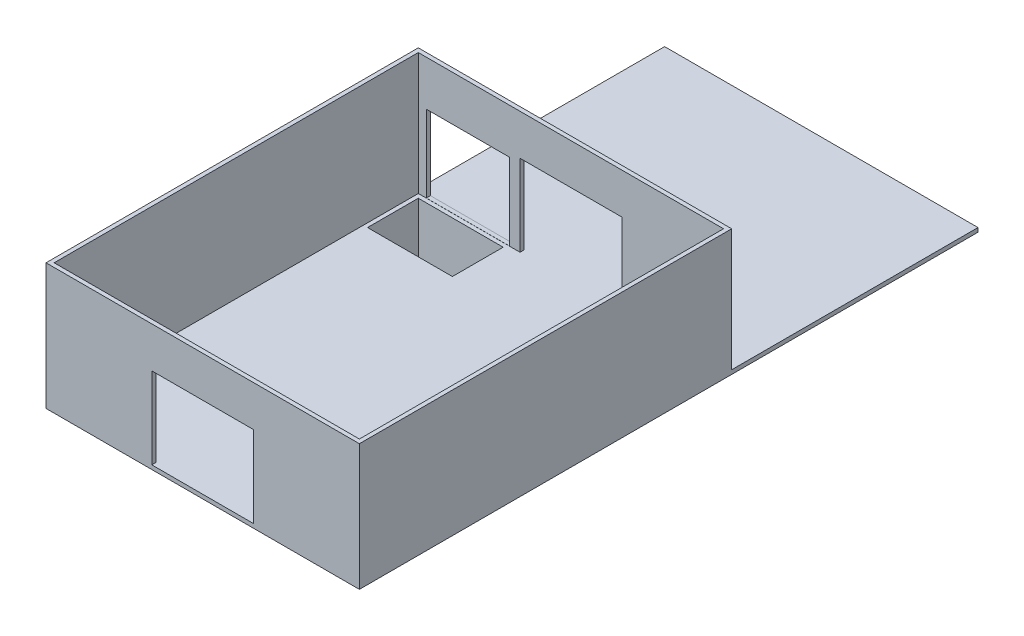
ISO-10303-21;
HEADER;
FILE_DESCRIPTION(('STEP AP214'),'2;1');
FILE_NAME('part.step','',(''),(''),'','','');
FILE_SCHEMA(('AUTOMOTIVE_DESIGN { 1 0 10303 214 1 1 1 1 }'));
ENDSEC;
DATA;
#1=APPLICATION_CONTEXT('core data for automotive mechanical design processes');
#2=APPLICATION_PROTOCOL_DEFINITION('international standard','automotive_design',2000,#1);
#3=PRODUCT_CONTEXT('',#1,'mechanical');
#4=PRODUCT('Part','Part','',(#3));
#5=PRODUCT_RELATED_PRODUCT_CATEGORY('part','',(#4));
#6=PRODUCT_DEFINITION_FORMATION('','',#4);
#7=PRODUCT_DEFINITION_CONTEXT('part definition',#1,'design');
#8=PRODUCT_DEFINITION('design','',#6,#7);
#9=PRODUCT_DEFINITION_SHAPE('','',#8);
#10=(LENGTH_UNIT() NAMED_UNIT(*) SI_UNIT(.MILLI.,.METRE.));
#11=(NAMED_UNIT(*) PLANE_ANGLE_UNIT() SI_UNIT($,.RADIAN.));
#12=(NAMED_UNIT(*) SI_UNIT($,.STERADIAN.) SOLID_ANGLE_UNIT());
#13=UNCERTAINTY_MEASURE_WITH_UNIT(LENGTH_MEASURE(1.E-05),#10,'distance_accuracy_value','');
#14=(GEOMETRIC_REPRESENTATION_CONTEXT(3) GLOBAL_UNCERTAINTY_ASSIGNED_CONTEXT((#13)) GLOBAL_UNIT_ASSIGNED_CONTEXT((#10,
#11,#12)) REPRESENTATION_CONTEXT('',''));
#15=CARTESIAN_POINT('',(0.,0.,0.));
#16=DIRECTION('',(0.,0.,1.));
#17=DIRECTION('',(1.,0.,0.));
#18=AXIS2_PLACEMENT_3D('',#15,#16,#17);
#19=CARTESIAN_POINT('',(-7700.,6000.,0.));
#20=DIRECTION('',(1.,0.,0.));
#21=DIRECTION('',(0.,0.,-1.));
#22=AXIS2_PLACEMENT_3D('',#19,#20,#21);
#23=PLANE('',#22);
#24=DIRECTION('',(0.,1.,0.));
#25=VECTOR('',#24,1.);
#26=CARTESIAN_POINT('',(-7700.,6000.,-3095.4255966185));
#27=LINE('',#26,#25);
#28=CARTESIAN_POINT('',(-7700.,0.,-3095.4255966185));
#29=VERTEX_POINT('',#28);
#30=CARTESIAN_POINT('',(-7700.,6000.,-3095.4255966185));
#31=VERTEX_POINT('',#30);
#32=EDGE_CURVE('E262',#29,#31,#27,.T.);
#33=ORIENTED_EDGE('',*,*,#32,.F.);
#34=DIRECTION('',(0.,0.,-1.));
#35=VECTOR('',#34,1.);
#36=CARTESIAN_POINT('',(-7700.,0.,0.));
#37=LINE('',#36,#35);
#38=CARTESIAN_POINT('',(-7700.,0.,-15200.));
#39=VERTEX_POINT('',#38);
#40=EDGE_CURVE('E272',#29,#39,#37,.T.);
#41=ORIENTED_EDGE('',*,*,#40,.T.);
#42=DIRECTION('',(0.,-1.,0.));
#43=VECTOR('',#42,1.);
#44=CARTESIAN_POINT('',(-7700.,6000.,-15200.));
#45=LINE('',#44,#43);
#46=CARTESIAN_POINT('',(-7700.,-200.,-15200.));
#47=VERTEX_POINT('',#46);
#48=EDGE_CURVE('E68',#39,#47,#45,.T.);
#49=ORIENTED_EDGE('',*,*,#48,.T.);
#50=DIRECTION('',(0.,0.,1.));
#51=VECTOR('',#50,1.);
#52=CARTESIAN_POINT('',(-7700.,-200.,0.));
#53=LINE('',#52,#51);
#54=CARTESIAN_POINT('',(-7700.,-200.,15200.));
#55=VERTEX_POINT('',#54);
#56=EDGE_CURVE('E426',#47,#55,#53,.T.);
#57=ORIENTED_EDGE('',*,*,#56,.T.);
#58=DIRECTION('',(0.,-1.,0.));
#59=VECTOR('',#58,1.);
#60=CARTESIAN_POINT('',(-7700.,6000.,15200.));
#61=LINE('',#60,#59);
#62=CARTESIAN_POINT('',(-7700.,6000.,15200.));
#63=VERTEX_POINT('',#62);
#64=EDGE_CURVE('E471',#63,#55,#61,.T.);
#65=ORIENTED_EDGE('',*,*,#64,.F.);
#66=DIRECTION('',(0.,0.,1.));
#67=VECTOR('',#66,1.);
#68=CARTESIAN_POINT('',(-7700.,6000.,0.));
#69=LINE('',#68,#67);
#70=EDGE_CURVE('E282',#31,#63,#69,.T.);
#71=ORIENTED_EDGE('',*,*,#70,.F.);
#72=EDGE_LOOP('',(#33,#41,#49,#57,#65,#71));
#73=FACE_BOUND('',#72,.T.);
#74=ADVANCED_FACE('F60',(#73),#23,.F.);
#75=CARTESIAN_POINT('',(7700.,6000.,-2.24966244463519E-13));
#76=DIRECTION('',(1.,0.,0.));
#77=DIRECTION('',(0.,0.,-1.));
#78=AXIS2_PLACEMENT_3D('',#75,#76,#77);
#79=PLANE('',#78);
#80=DIRECTION('',(0.,0.,-1.));
#81=VECTOR('',#80,1.);
#82=CARTESIAN_POINT('',(7700.,0.,-2.24966244463519E-13));
#83=LINE('',#82,#81);
#84=CARTESIAN_POINT('',(7700.,0.,-3095.4255966185));
#85=VERTEX_POINT('',#84);
#86=CARTESIAN_POINT('',(7700.,0.,-15200.));
#87=VERTEX_POINT('',#86);
#88=EDGE_CURVE('E279',#85,#87,#83,.T.);
#89=ORIENTED_EDGE('',*,*,#88,.F.);
#90=DIRECTION('',(0.,1.,0.));
#91=VECTOR('',#90,1.);
#92=CARTESIAN_POINT('',(7700.,6000.,-3095.4255966185));
#93=LINE('',#92,#91);
#94=CARTESIAN_POINT('',(7700.,6000.,-3095.4255966185));
#95=VERTEX_POINT('',#94);
#96=EDGE_CURVE('E283',#85,#95,#93,.T.);
#97=ORIENTED_EDGE('',*,*,#96,.T.);
#98=DIRECTION('',(0.,0.,1.));
#99=VECTOR('',#98,1.);
#100=CARTESIAN_POINT('',(7700.,6000.,-2.24966244463519E-13));
#101=LINE('',#100,#99);
#102=CARTESIAN_POINT('',(7700.,6000.,15200.));
#103=VERTEX_POINT('',#102);
#104=EDGE_CURVE('E452',#95,#103,#101,.T.);
#105=ORIENTED_EDGE('',*,*,#104,.T.);
#106=DIRECTION('',(0.,-1.,0.));
#107=VECTOR('',#106,1.);
#108=CARTESIAN_POINT('',(7700.,6000.,15200.));
#109=LINE('',#108,#107);
#110=CARTESIAN_POINT('',(7700.,-200.,15200.));
#111=VERTEX_POINT('',#110);
#112=EDGE_CURVE('E468',#103,#111,#109,.T.);
#113=ORIENTED_EDGE('',*,*,#112,.T.);
#114=DIRECTION('',(0.,0.,1.));
#115=VECTOR('',#114,1.);
#116=CARTESIAN_POINT('',(7700.,-200.,-2.24966244463519E-13));
#117=LINE('',#116,#115);
#118=CARTESIAN_POINT('',(7700.,-200.,-15200.));
#119=VERTEX_POINT('',#118);
#120=EDGE_CURVE('E432',#119,#111,#117,.T.);
#121=ORIENTED_EDGE('',*,*,#120,.F.);
#122=DIRECTION('',(0.,-1.,0.));
#123=VECTOR('',#122,1.);
#124=CARTESIAN_POINT('',(7700.,6000.,-15200.));
#125=LINE('',#124,#123);
#126=EDGE_CURVE('E466',#87,#119,#125,.T.);
#127=ORIENTED_EDGE('',*,*,#126,.F.);
#128=EDGE_LOOP('',(#89,#97,#105,#113,#121,#127));
#129=FACE_BOUND('',#128,.T.);
#130=ADVANCED_FACE('F522',(#129),#79,.T.);
#131=CARTESIAN_POINT('',(0.,6000.,0.));
#132=DIRECTION('',(0.,1.,0.));
#133=DIRECTION('',(0.,0.,1.));
#134=AXIS2_PLACEMENT_3D('',#131,#132,#133);
#135=PLANE('',#134);
#136=DIRECTION('',(1.,0.,0.));
#137=VECTOR('',#136,1.);
#138=CARTESIAN_POINT('',(0.,6000.,-2895.4255966185));
#139=LINE('',#138,#137);
#140=CARTESIAN_POINT('',(-7500.,6000.,-2895.4255966185));
#141=VERTEX_POINT('',#140);
#142=CARTESIAN_POINT('',(7500.,6000.,-2895.4255966185));
#143=VERTEX_POINT('',#142);
#144=EDGE_CURVE('E268',#141,#143,#139,.T.);
#145=ORIENTED_EDGE('',*,*,#144,.T.);
#146=DIRECTION('',(0.,0.,1.));
#147=VECTOR('',#146,1.);
#148=CARTESIAN_POINT('',(7500.,6000.,0.));
#149=LINE('',#148,#147);
#150=CARTESIAN_POINT('',(7500.,6000.,15000.));
#151=VERTEX_POINT('',#150);
#152=EDGE_CURVE('E438',#143,#151,#149,.T.);
#153=ORIENTED_EDGE('',*,*,#152,.T.);
#154=DIRECTION('',(1.,0.,0.));
#155=VECTOR('',#154,1.);
#156=CARTESIAN_POINT('',(0.,6000.,15000.));
#157=LINE('',#156,#155);
#158=CARTESIAN_POINT('',(-7500.,6000.,15000.));
#159=VERTEX_POINT('',#158);
#160=EDGE_CURVE('E440',#159,#151,#157,.T.);
#161=ORIENTED_EDGE('',*,*,#160,.F.);
#162=DIRECTION('',(0.,0.,1.));
#163=VECTOR('',#162,1.);
#164=CARTESIAN_POINT('',(-7500.,6000.,1.11022302462516E-12));
#165=LINE('',#164,#163);
#166=EDGE_CURVE('E443',#141,#159,#165,.T.);
#167=ORIENTED_EDGE('',*,*,#166,.F.);
#168=EDGE_LOOP('',(#145,#153,#161,#167));
#169=FACE_BOUND('',#168,.T.);
#170=ORIENTED_EDGE('',*,*,#104,.F.);
#171=DIRECTION('',(1.,0.,0.));
#172=VECTOR('',#171,1.);
#173=CARTESIAN_POINT('',(0.,6000.,-3095.4255966185));
#174=LINE('',#173,#172);
#175=EDGE_CURVE('E446',#31,#95,#174,.T.);
#176=ORIENTED_EDGE('',*,*,#175,.F.);
#177=ORIENTED_EDGE('',*,*,#70,.T.);
#178=DIRECTION('',(1.,0.,0.));
#179=VECTOR('',#178,1.);
#180=CARTESIAN_POINT('',(0.,6000.,15200.));
#181=LINE('',#180,#179);
#182=EDGE_CURVE('E449',#63,#103,#181,.T.);
#183=ORIENTED_EDGE('',*,*,#182,.T.);
#184=EDGE_LOOP('',(#170,#176,#177,#183));
#185=FACE_BOUND('',#184,.T.);
#186=ADVANCED_FACE('F499',(#169,#185),#135,.T.);
#187=CARTESIAN_POINT('',(0.,6000.,-15200.));
#188=DIRECTION('',(0.,0.,-1.));
#189=DIRECTION('',(-1.,0.,0.));
#190=AXIS2_PLACEMENT_3D('',#187,#188,#189);
#191=PLANE('',#190);
#192=DIRECTION('',(1.,0.,0.));
#193=VECTOR('',#192,1.);
#194=CARTESIAN_POINT('',(-2500.,0.,-15200.));
#195=LINE('',#194,#193);
#196=EDGE_CURVE('E276',#39,#87,#195,.T.);
#197=ORIENTED_EDGE('',*,*,#196,.T.);
#198=ORIENTED_EDGE('',*,*,#126,.T.);
#199=DIRECTION('',(1.,0.,0.));
#200=VECTOR('',#199,1.);
#201=CARTESIAN_POINT('',(0.,-200.,-15200.));
#202=LINE('',#201,#200);
#203=EDGE_CURVE('E423',#47,#119,#202,.T.);
#204=ORIENTED_EDGE('',*,*,#203,.F.);
#205=ORIENTED_EDGE('',*,*,#48,.F.);
#206=EDGE_LOOP('',(#197,#198,#204,#205));
#207=FACE_BOUND('',#206,.T.);
#208=ADVANCED_FACE('F526',(#207),#191,.T.);
#209=CARTESIAN_POINT('',(0.,6000.,15200.));
#210=DIRECTION('',(0.,0.,-1.));
#211=DIRECTION('',(-1.,0.,0.));
#212=AXIS2_PLACEMENT_3D('',#209,#210,#211);
#213=PLANE('',#212);
#214=DIRECTION('',(1.,0.,0.));
#215=VECTOR('',#214,1.);
#216=CARTESIAN_POINT('',(-2500.,0.,15200.));
#217=LINE('',#216,#215);
#218=CARTESIAN_POINT('',(-2500.,0.,15200.));
#219=VERTEX_POINT('',#218);
#220=CARTESIAN_POINT('',(2500.,0.,15200.));
#221=VERTEX_POINT('',#220);
#222=EDGE_CURVE('E383',#219,#221,#217,.T.);
#223=ORIENTED_EDGE('',*,*,#222,.F.);
#224=DIRECTION('',(0.,-1.,0.));
#225=VECTOR('',#224,1.);
#226=CARTESIAN_POINT('',(-2500.,0.,15200.));
#227=LINE('',#226,#225);
#228=CARTESIAN_POINT('',(-2500.,4000.,15200.));
#229=VERTEX_POINT('',#228);
#230=EDGE_CURVE('E378',#229,#219,#227,.T.);
#231=ORIENTED_EDGE('',*,*,#230,.F.);
#232=DIRECTION('',(-1.,0.,0.));
#233=VECTOR('',#232,1.);
#234=CARTESIAN_POINT('',(-2500.,4000.,15200.));
#235=LINE('',#234,#233);
#236=CARTESIAN_POINT('',(2500.,4000.,15200.));
#237=VERTEX_POINT('',#236);
#238=EDGE_CURVE('E381',#237,#229,#235,.T.);
#239=ORIENTED_EDGE('',*,*,#238,.F.);
#240=DIRECTION('',(0.,1.,0.));
#241=VECTOR('',#240,1.);
#242=CARTESIAN_POINT('',(2500.,0.,15200.));
#243=LINE('',#242,#241);
#244=EDGE_CURVE('E386',#221,#237,#243,.T.);
#245=ORIENTED_EDGE('',*,*,#244,.F.);
#246=EDGE_LOOP('',(#223,#231,#239,#245));
#247=FACE_BOUND('',#246,.T.);
#248=ORIENTED_EDGE('',*,*,#64,.T.);
#249=DIRECTION('',(1.,0.,0.));
#250=VECTOR('',#249,1.);
#251=CARTESIAN_POINT('',(0.,-200.,15200.));
#252=LINE('',#251,#250);
#253=EDGE_CURVE('E429',#55,#111,#252,.T.);
#254=ORIENTED_EDGE('',*,*,#253,.T.);
#255=ORIENTED_EDGE('',*,*,#112,.F.);
#256=ORIENTED_EDGE('',*,*,#182,.F.);
#257=EDGE_LOOP('',(#248,#254,#255,#256));
#258=FACE_BOUND('',#257,.T.);
#259=ADVANCED_FACE('F533',(#247,#258),#213,.F.);
#260=CARTESIAN_POINT('',(0.,6000.,-3095.4255966185));
#261=DIRECTION('',(0.,0.,-1.));
#262=DIRECTION('',(-1.,0.,0.));
#263=AXIS2_PLACEMENT_3D('',#260,#261,#262);
#264=PLANE('',#263);
#265=DIRECTION('',(0.,-1.,0.));
#266=VECTOR('',#265,1.);
#267=CARTESIAN_POINT('',(-3013.08847845024,6000.,-3095.4255966185));
#268=LINE('',#267,#266);
#269=CARTESIAN_POINT('',(-3013.08847845024,3786.82054214032,-3095.4255966185));
#270=VERTEX_POINT('',#269);
#271=CARTESIAN_POINT('',(-3013.08847845024,5.91228646919756,-3095.4255966185));
#272=VERTEX_POINT('',#271);
#273=EDGE_CURVE('E311',#270,#272,#268,.T.);
#274=ORIENTED_EDGE('',*,*,#273,.F.);
#275=DIRECTION('',(1.,0.,0.));
#276=VECTOR('',#275,1.);
#277=CARTESIAN_POINT('',(2.40009307716138E-13,3786.82054214032,-3095.4255966185));
#278=LINE('',#277,#276);
#279=CARTESIAN_POINT('',(-7108.13431667134,3786.82054214032,-3095.4255966185));
#280=VERTEX_POINT('',#279);
#281=EDGE_CURVE('E301',#280,#270,#278,.T.);
#282=ORIENTED_EDGE('',*,*,#281,.F.);
#283=DIRECTION('',(0.,1.,0.));
#284=VECTOR('',#283,1.);
#285=CARTESIAN_POINT('',(-7108.13431667134,6000.,-3095.4255966185));
#286=LINE('',#285,#284);
#287=CARTESIAN_POINT('',(-7108.13431667134,5.91228646919706,-3095.4255966185));
#288=VERTEX_POINT('',#287);
#289=EDGE_CURVE('E307',#288,#280,#286,.T.);
#290=ORIENTED_EDGE('',*,*,#289,.F.);
#291=DIRECTION('',(-1.,0.,0.));
#292=VECTOR('',#291,1.);
#293=CARTESIAN_POINT('',(7.31285681367118E-13,5.91228646919717,-3095.4255966185));
#294=LINE('',#293,#292);
#295=EDGE_CURVE('E309',#272,#288,#294,.T.);
#296=ORIENTED_EDGE('',*,*,#295,.F.);
#297=EDGE_LOOP('',(#274,#282,#290,#296));
#298=FACE_BOUND('',#297,.T.);
#299=DIRECTION('',(0.,1.,0.));
#300=VECTOR('',#299,1.);
#301=CARTESIAN_POINT('',(-2500.,6000.,-3095.4255966185));
#302=LINE('',#301,#300);
#303=CARTESIAN_POINT('',(-2500.,0.,-3095.4255966185));
#304=VERTEX_POINT('',#303);
#305=CARTESIAN_POINT('',(-2500.,4000.,-3095.4255966185));
#306=VERTEX_POINT('',#305);
#307=EDGE_CURVE('E265',#304,#306,#302,.T.);
#308=ORIENTED_EDGE('',*,*,#307,.F.);
#309=DIRECTION('',(1.,0.,0.));
#310=VECTOR('',#309,1.);
#311=CARTESIAN_POINT('',(0.,0.,-3095.4255966185));
#312=LINE('',#311,#310);
#313=EDGE_CURVE('E258',#29,#304,#312,.T.);
#314=ORIENTED_EDGE('',*,*,#313,.F.);
#315=ORIENTED_EDGE('',*,*,#32,.T.);
#316=ORIENTED_EDGE('',*,*,#175,.T.);
#317=ORIENTED_EDGE('',*,*,#96,.F.);
#318=CARTESIAN_POINT('',(2500.,0.,-3095.4255966185));
#319=VERTEX_POINT('',#318);
#320=EDGE_CURVE('E269',#319,#85,#312,.T.);
#321=ORIENTED_EDGE('',*,*,#320,.F.);
#322=DIRECTION('',(0.,-1.,0.));
#323=VECTOR('',#322,1.);
#324=CARTESIAN_POINT('',(2500.,6000.,-3095.4255966185));
#325=LINE('',#324,#323);
#326=CARTESIAN_POINT('',(2500.,4000.,-3095.4255966185));
#327=VERTEX_POINT('',#326);
#328=EDGE_CURVE('E409',#327,#319,#325,.T.);
#329=ORIENTED_EDGE('',*,*,#328,.F.);
#330=DIRECTION('',(1.,0.,0.));
#331=VECTOR('',#330,1.);
#332=CARTESIAN_POINT('',(0.,4000.,-3095.4255966185));
#333=LINE('',#332,#331);
#334=EDGE_CURVE('E421',#306,#327,#333,.T.);
#335=ORIENTED_EDGE('',*,*,#334,.F.);
#336=EDGE_LOOP('',(#308,#314,#315,#316,#317,#321,#329,#335));
#337=FACE_BOUND('',#336,.T.);
#338=ADVANCED_FACE('F260',(#298,#337),#264,.T.);
#339=CARTESIAN_POINT('',(0.,6000.,-2895.4255966185));
#340=DIRECTION('',(0.,0.,-1.));
#341=DIRECTION('',(-1.,0.,0.));
#342=AXIS2_PLACEMENT_3D('',#339,#340,#341);
#343=PLANE('',#342);
#344=DIRECTION('',(-1.,0.,0.));
#345=VECTOR('',#344,1.);
#346=CARTESIAN_POINT('',(-3013.08847845024,3786.82054214032,-2895.4255966185));
#347=LINE('',#346,#345);
#348=CARTESIAN_POINT('',(-3013.08847845024,3786.82054214032,-2895.4255966185));
#349=VERTEX_POINT('',#348);
#350=CARTESIAN_POINT('',(-7108.13431667134,3786.82054214032,-2895.4255966185));
#351=VERTEX_POINT('',#350);
#352=EDGE_CURVE('E290',#349,#351,#347,.T.);
#353=ORIENTED_EDGE('',*,*,#352,.F.);
#354=DIRECTION('',(0.,1.,0.));
#355=VECTOR('',#354,1.);
#356=CARTESIAN_POINT('',(-3013.08847845024,5.91228646919756,-2895.4255966185));
#357=LINE('',#356,#355);
#358=CARTESIAN_POINT('',(-3013.08847845024,5.91228646919756,-2895.4255966185));
#359=VERTEX_POINT('',#358);
#360=EDGE_CURVE('E83',#359,#349,#357,.T.);
#361=ORIENTED_EDGE('',*,*,#360,.F.);
#362=DIRECTION('',(1.,0.,0.));
#363=VECTOR('',#362,1.);
#364=CARTESIAN_POINT('',(-3013.08847845024,5.91228646919756,-2895.4255966185));
#365=LINE('',#364,#363);
#366=CARTESIAN_POINT('',(-7108.13431667134,5.91228646919706,-2895.4255966185));
#367=VERTEX_POINT('',#366);
#368=EDGE_CURVE('E295',#367,#359,#365,.T.);
#369=ORIENTED_EDGE('',*,*,#368,.F.);
#370=DIRECTION('',(0.,-1.,0.));
#371=VECTOR('',#370,1.);
#372=CARTESIAN_POINT('',(-7108.13431667134,5.91228646919706,-2895.4255966185));
#373=LINE('',#372,#371);
#374=EDGE_CURVE('E292',#351,#367,#373,.T.);
#375=ORIENTED_EDGE('',*,*,#374,.F.);
#376=EDGE_LOOP('',(#353,#361,#369,#375));
#377=FACE_BOUND('',#376,.T.);
#378=DIRECTION('',(0.,-1.,0.));
#379=VECTOR('',#378,1.);
#380=CARTESIAN_POINT('',(-7500.,6000.,-2895.4255966185));
#381=LINE('',#380,#379);
#382=CARTESIAN_POINT('',(-7500.,0.,-2895.4255966185));
#383=VERTEX_POINT('',#382);
#384=EDGE_CURVE('E454',#141,#383,#381,.T.);
#385=ORIENTED_EDGE('',*,*,#384,.T.);
#386=DIRECTION('',(1.,0.,0.));
#387=VECTOR('',#386,1.);
#388=CARTESIAN_POINT('',(0.,0.,-2895.4255966185));
#389=LINE('',#388,#387);
#390=CARTESIAN_POINT('',(-2500.,0.,-2895.4255966185));
#391=VERTEX_POINT('',#390);
#392=EDGE_CURVE('E455',#383,#391,#389,.T.);
#393=ORIENTED_EDGE('',*,*,#392,.T.);
#394=DIRECTION('',(0.,1.,0.));
#395=VECTOR('',#394,1.);
#396=CARTESIAN_POINT('',(-2500.,6000.,-2895.4255966185));
#397=LINE('',#396,#395);
#398=CARTESIAN_POINT('',(-2500.,4000.,-2895.4255966185));
#399=VERTEX_POINT('',#398);
#400=EDGE_CURVE('E414',#391,#399,#397,.T.);
#401=ORIENTED_EDGE('',*,*,#400,.T.);
#402=DIRECTION('',(1.,0.,0.));
#403=VECTOR('',#402,1.);
#404=CARTESIAN_POINT('',(0.,4000.,-2895.4255966185));
#405=LINE('',#404,#403);
#406=CARTESIAN_POINT('',(2500.,4000.,-2895.4255966185));
#407=VERTEX_POINT('',#406);
#408=EDGE_CURVE('E418',#399,#407,#405,.T.);
#409=ORIENTED_EDGE('',*,*,#408,.T.);
#410=DIRECTION('',(0.,-1.,0.));
#411=VECTOR('',#410,1.);
#412=CARTESIAN_POINT('',(2500.,6000.,-2895.4255966185));
#413=LINE('',#412,#411);
#414=CARTESIAN_POINT('',(2500.,0.,-2895.4255966185));
#415=VERTEX_POINT('',#414);
#416=EDGE_CURVE('E406',#407,#415,#413,.T.);
#417=ORIENTED_EDGE('',*,*,#416,.T.);
#418=CARTESIAN_POINT('',(7500.,0.,-2895.4255966185));
#419=VERTEX_POINT('',#418);
#420=EDGE_CURVE('E435',#415,#419,#389,.T.);
#421=ORIENTED_EDGE('',*,*,#420,.T.);
#422=DIRECTION('',(0.,-1.,0.));
#423=VECTOR('',#422,1.);
#424=CARTESIAN_POINT('',(7500.,6000.,-2895.4255966185));
#425=LINE('',#424,#423);
#426=EDGE_CURVE('E469',#143,#419,#425,.T.);
#427=ORIENTED_EDGE('',*,*,#426,.F.);
#428=ORIENTED_EDGE('',*,*,#144,.F.);
#429=EDGE_LOOP('',(#385,#393,#401,#409,#417,#421,#427,#428));
#430=FACE_BOUND('',#429,.T.);
#431=ADVANCED_FACE('F62',(#377,#430),#343,.F.);
#432=CARTESIAN_POINT('',(7500.,6000.,0.));
#433=DIRECTION('',(1.,0.,0.));
#434=DIRECTION('',(0.,0.,-1.));
#435=AXIS2_PLACEMENT_3D('',#432,#433,#434);
#436=PLANE('',#435);
#437=DIRECTION('',(0.,0.,1.));
#438=VECTOR('',#437,1.);
#439=CARTESIAN_POINT('',(7500.,0.,0.));
#440=LINE('',#439,#438);
#441=CARTESIAN_POINT('',(7500.,0.,15000.));
#442=VERTEX_POINT('',#441);
#443=EDGE_CURVE('E457',#419,#442,#440,.T.);
#444=ORIENTED_EDGE('',*,*,#443,.T.);
#445=DIRECTION('',(0.,-1.,0.));
#446=VECTOR('',#445,1.);
#447=CARTESIAN_POINT('',(7500.,6000.,15000.));
#448=LINE('',#447,#446);
#449=EDGE_CURVE('E479',#151,#442,#448,.T.);
#450=ORIENTED_EDGE('',*,*,#449,.F.);
#451=ORIENTED_EDGE('',*,*,#152,.F.);
#452=ORIENTED_EDGE('',*,*,#426,.T.);
#453=EDGE_LOOP('',(#444,#450,#451,#452));
#454=FACE_BOUND('',#453,.T.);
#455=ADVANCED_FACE('F484',(#454),#436,.F.);
#456=CARTESIAN_POINT('',(0.,6000.,15000.));
#457=DIRECTION('',(0.,0.,-1.));
#458=DIRECTION('',(-1.,0.,0.));
#459=AXIS2_PLACEMENT_3D('',#456,#457,#458);
#460=PLANE('',#459);
#461=DIRECTION('',(0.,1.,0.));
#462=VECTOR('',#461,1.);
#463=CARTESIAN_POINT('',(-2500.,6000.,15000.));
#464=LINE('',#463,#462);
#465=CARTESIAN_POINT('',(-2500.,0.,15000.));
#466=VERTEX_POINT('',#465);
#467=CARTESIAN_POINT('',(-2500.,4000.,15000.));
#468=VERTEX_POINT('',#467);
#469=EDGE_CURVE('E412',#466,#468,#464,.T.);
#470=ORIENTED_EDGE('',*,*,#469,.F.);
#471=DIRECTION('',(1.,0.,0.));
#472=VECTOR('',#471,1.);
#473=CARTESIAN_POINT('',(0.,0.,15000.));
#474=LINE('',#473,#472);
#475=CARTESIAN_POINT('',(-7500.,0.,15000.));
#476=VERTEX_POINT('',#475);
#477=EDGE_CURVE('E461',#476,#466,#474,.T.);
#478=ORIENTED_EDGE('',*,*,#477,.F.);
#479=DIRECTION('',(0.,-1.,0.));
#480=VECTOR('',#479,1.);
#481=CARTESIAN_POINT('',(-7500.,6000.,15000.));
#482=LINE('',#481,#480);
#483=EDGE_CURVE('E476',#159,#476,#482,.T.);
#484=ORIENTED_EDGE('',*,*,#483,.F.);
#485=ORIENTED_EDGE('',*,*,#160,.T.);
#486=ORIENTED_EDGE('',*,*,#449,.T.);
#487=CARTESIAN_POINT('',(2500.,0.,15000.));
#488=VERTEX_POINT('',#487);
#489=EDGE_CURVE('E460',#488,#442,#474,.T.);
#490=ORIENTED_EDGE('',*,*,#489,.F.);
#491=DIRECTION('',(0.,-1.,0.));
#492=VECTOR('',#491,1.);
#493=CARTESIAN_POINT('',(2500.,6000.,15000.));
#494=LINE('',#493,#492);
#495=CARTESIAN_POINT('',(2500.,4000.,15000.));
#496=VERTEX_POINT('',#495);
#497=EDGE_CURVE('E403',#496,#488,#494,.T.);
#498=ORIENTED_EDGE('',*,*,#497,.F.);
#499=DIRECTION('',(1.,0.,0.));
#500=VECTOR('',#499,1.);
#501=CARTESIAN_POINT('',(0.,4000.,15000.));
#502=LINE('',#501,#500);
#503=EDGE_CURVE('E12',#468,#496,#502,.T.);
#504=ORIENTED_EDGE('',*,*,#503,.F.);
#505=EDGE_LOOP('',(#470,#478,#484,#485,#486,#490,#498,#504));
#506=FACE_BOUND('',#505,.T.);
#507=ADVANCED_FACE('F495',(#506),#460,.T.);
#508=CARTESIAN_POINT('',(-7500.,6000.,1.11022302462516E-12));
#509=DIRECTION('',(1.,0.,0.));
#510=DIRECTION('',(0.,0.,-1.));
#511=AXIS2_PLACEMENT_3D('',#508,#509,#510);
#512=PLANE('',#511);
#513=DIRECTION('',(0.,0.,1.));
#514=VECTOR('',#513,1.);
#515=CARTESIAN_POINT('',(-7500.,0.,1.11022302462516E-12));
#516=LINE('',#515,#514);
#517=EDGE_CURVE('E464',#383,#476,#516,.T.);
#518=ORIENTED_EDGE('',*,*,#517,.F.);
#519=ORIENTED_EDGE('',*,*,#384,.F.);
#520=ORIENTED_EDGE('',*,*,#166,.T.);
#521=ORIENTED_EDGE('',*,*,#483,.T.);
#522=EDGE_LOOP('',(#518,#519,#520,#521));
#523=FACE_BOUND('',#522,.T.);
#524=ADVANCED_FACE('F502',(#523),#512,.T.);
#525=CARTESIAN_POINT('',(0.,0.,0.));
#526=DIRECTION('',(0.,1.,0.));
#527=DIRECTION('',(0.,0.,1.));
#528=AXIS2_PLACEMENT_3D('',#525,#526,#527);
#529=PLANE('',#528);
#530=ORIENTED_EDGE('',*,*,#320,.T.);
#531=ORIENTED_EDGE('',*,*,#88,.T.);
#532=ORIENTED_EDGE('',*,*,#196,.F.);
#533=ORIENTED_EDGE('',*,*,#40,.F.);
#534=ORIENTED_EDGE('',*,*,#313,.T.);
#535=DIRECTION('',(0.,0.,1.));
#536=VECTOR('',#535,1.);
#537=CARTESIAN_POINT('',(-2500.,0.,-15200.));
#538=LINE('',#537,#536);
#539=EDGE_CURVE('E400',#304,#391,#538,.T.);
#540=ORIENTED_EDGE('',*,*,#539,.T.);
#541=ORIENTED_EDGE('',*,*,#392,.F.);
#542=ORIENTED_EDGE('',*,*,#517,.T.);
#543=ORIENTED_EDGE('',*,*,#477,.T.);
#544=EDGE_CURVE('E380',#466,#219,#538,.T.);
#545=ORIENTED_EDGE('',*,*,#544,.T.);
#546=ORIENTED_EDGE('',*,*,#222,.T.);
#547=DIRECTION('',(0.,0.,1.));
#548=VECTOR('',#547,1.);
#549=CARTESIAN_POINT('',(2500.,0.,-15200.));
#550=LINE('',#549,#548);
#551=EDGE_CURVE('E398',#488,#221,#550,.T.);
#552=ORIENTED_EDGE('',*,*,#551,.F.);
#553=ORIENTED_EDGE('',*,*,#489,.T.);
#554=ORIENTED_EDGE('',*,*,#443,.F.);
#555=ORIENTED_EDGE('',*,*,#420,.F.);
#556=EDGE_CURVE('E397',#319,#415,#550,.T.);
#557=ORIENTED_EDGE('',*,*,#556,.F.);
#558=EDGE_LOOP('',(#530,#531,#532,#533,#534,#540,#541,#542,#543,#545,#546,#552,#553,#554,#555,#557));
#559=FACE_BOUND('',#558,.T.);
#560=DIRECTION('',(0.,0.,1.));
#561=VECTOR('',#560,1.);
#562=CARTESIAN_POINT('',(-7300.,0.,0.));
#563=LINE('',#562,#561);
#564=CARTESIAN_POINT('',(-7300.,0.,-2695.4255966185));
#565=VERTEX_POINT('',#564);
#566=CARTESIAN_POINT('',(-7300.,0.,-200.));
#567=VERTEX_POINT('',#566);
#568=EDGE_CURVE('E325',#565,#567,#563,.T.);
#569=ORIENTED_EDGE('',*,*,#568,.F.);
#570=DIRECTION('',(1.,0.,0.));
#571=VECTOR('',#570,1.);
#572=CARTESIAN_POINT('',(0.,0.,-2695.4255966185));
#573=LINE('',#572,#571);
#574=CARTESIAN_POINT('',(-3129.80607413163,0.,-2695.4255966185));
#575=VERTEX_POINT('',#574);
#576=EDGE_CURVE('E340',#565,#575,#573,.T.);
#577=ORIENTED_EDGE('',*,*,#576,.T.);
#578=DIRECTION('',(0.,0.,1.));
#579=VECTOR('',#578,1.);
#580=CARTESIAN_POINT('',(-3129.80607413163,0.,0.));
#581=LINE('',#580,#579);
#582=CARTESIAN_POINT('',(-3129.80607413163,0.,-200.));
#583=VERTEX_POINT('',#582);
#584=EDGE_CURVE('E343',#575,#583,#581,.T.);
#585=ORIENTED_EDGE('',*,*,#584,.T.);
#586=DIRECTION('',(1.,0.,0.));
#587=VECTOR('',#586,1.);
#588=CARTESIAN_POINT('',(0.,0.,-200.));
#589=LINE('',#588,#587);
#590=EDGE_CURVE('E329',#567,#583,#589,.T.);
#591=ORIENTED_EDGE('',*,*,#590,.F.);
#592=EDGE_LOOP('',(#569,#577,#585,#591));
#593=FACE_BOUND('',#592,.T.);
#594=ADVANCED_FACE('F273',(#559,#593),#529,.T.);
#595=CARTESIAN_POINT('',(0.,-200.,0.));
#596=DIRECTION('',(0.,1.,0.));
#597=DIRECTION('',(0.,0.,1.));
#598=AXIS2_PLACEMENT_3D('',#595,#596,#597);
#599=PLANE('',#598);
#600=DIRECTION('',(0.,0.,1.));
#601=VECTOR('',#600,1.);
#602=CARTESIAN_POINT('',(-7500.,-200.,1.11022302462516E-12));
#603=LINE('',#602,#601);
#604=CARTESIAN_POINT('',(-7500.,-200.,-2895.4255966185));
#605=VERTEX_POINT('',#604);
#606=CARTESIAN_POINT('',(-7500.,-200.,0.));
#607=VERTEX_POINT('',#606);
#608=EDGE_CURVE('E372',#605,#607,#603,.T.);
#609=ORIENTED_EDGE('',*,*,#608,.T.);
#610=DIRECTION('',(1.,0.,0.));
#611=VECTOR('',#610,1.);
#612=CARTESIAN_POINT('',(0.,-200.,0.));
#613=LINE('',#612,#611);
#614=CARTESIAN_POINT('',(-2929.80607413163,-200.,0.));
#615=VERTEX_POINT('',#614);
#616=EDGE_CURVE('E375',#607,#615,#613,.T.);
#617=ORIENTED_EDGE('',*,*,#616,.T.);
#618=DIRECTION('',(0.,0.,1.));
#619=VECTOR('',#618,1.);
#620=CARTESIAN_POINT('',(-2929.80607413163,-200.,0.));
#621=LINE('',#620,#619);
#622=CARTESIAN_POINT('',(-2929.80607413163,-200.,-2895.4255966185));
#623=VERTEX_POINT('',#622);
#624=EDGE_CURVE('E351',#623,#615,#621,.T.);
#625=ORIENTED_EDGE('',*,*,#624,.F.);
#626=DIRECTION('',(-1.,0.,0.));
#627=VECTOR('',#626,1.);
#628=CARTESIAN_POINT('',(0.,-200.,-2895.4255966185));
#629=LINE('',#628,#627);
#630=EDGE_CURVE('E369',#623,#605,#629,.T.);
#631=ORIENTED_EDGE('',*,*,#630,.T.);
#632=EDGE_LOOP('',(#609,#617,#625,#631));
#633=FACE_BOUND('',#632,.T.);
#634=ORIENTED_EDGE('',*,*,#203,.T.);
#635=ORIENTED_EDGE('',*,*,#120,.T.);
#636=ORIENTED_EDGE('',*,*,#253,.F.);
#637=ORIENTED_EDGE('',*,*,#56,.F.);
#638=EDGE_LOOP('',(#634,#635,#636,#637));
#639=FACE_BOUND('',#638,.T.);
#640=ADVANCED_FACE('F530',(#633,#639),#599,.F.);
#641=CARTESIAN_POINT('',(2500.,0.,-15200.));
#642=DIRECTION('',(1.,0.,0.));
#643=DIRECTION('',(0.,0.,-1.));
#644=AXIS2_PLACEMENT_3D('',#641,#642,#643);
#645=PLANE('',#644);
#646=ORIENTED_EDGE('',*,*,#497,.T.);
#647=ORIENTED_EDGE('',*,*,#551,.T.);
#648=ORIENTED_EDGE('',*,*,#244,.T.);
#649=DIRECTION('',(0.,0.,1.));
#650=VECTOR('',#649,1.);
#651=CARTESIAN_POINT('',(2500.,4000.,-15200.));
#652=LINE('',#651,#650);
#653=EDGE_CURVE('E395',#496,#237,#652,.T.);
#654=ORIENTED_EDGE('',*,*,#653,.F.);
#655=EDGE_LOOP('',(#646,#647,#648,#654));
#656=FACE_BOUND('',#655,.T.);
#657=ADVANCED_FACE('F579',(#656),#645,.F.);
#658=CARTESIAN_POINT('',(-2500.,4000.,-15200.));
#659=DIRECTION('',(0.,1.,0.));
#660=DIRECTION('',(0.,0.,1.));
#661=AXIS2_PLACEMENT_3D('',#658,#659,#660);
#662=PLANE('',#661);
#663=ORIENTED_EDGE('',*,*,#503,.T.);
#664=ORIENTED_EDGE('',*,*,#653,.T.);
#665=ORIENTED_EDGE('',*,*,#238,.T.);
#666=DIRECTION('',(0.,0.,1.));
#667=VECTOR('',#666,1.);
#668=CARTESIAN_POINT('',(-2500.,4000.,-15200.));
#669=LINE('',#668,#667);
#670=EDGE_CURVE('E391',#468,#229,#669,.T.);
#671=ORIENTED_EDGE('',*,*,#670,.F.);
#672=EDGE_LOOP('',(#663,#664,#665,#671));
#673=FACE_BOUND('',#672,.T.);
#674=ADVANCED_FACE('F588',(#673),#662,.F.);
#675=CARTESIAN_POINT('',(-2500.,0.,-15200.));
#676=DIRECTION('',(-1.,0.,0.));
#677=DIRECTION('',(0.,0.,1.));
#678=AXIS2_PLACEMENT_3D('',#675,#676,#677);
#679=PLANE('',#678);
#680=ORIENTED_EDGE('',*,*,#469,.T.);
#681=ORIENTED_EDGE('',*,*,#670,.T.);
#682=ORIENTED_EDGE('',*,*,#230,.T.);
#683=ORIENTED_EDGE('',*,*,#544,.F.);
#684=EDGE_LOOP('',(#680,#681,#682,#683));
#685=FACE_BOUND('',#684,.T.);
#686=ADVANCED_FACE('F596',(#685),#679,.F.);
#687=ORIENTED_EDGE('',*,*,#328,.T.);
#688=ORIENTED_EDGE('',*,*,#556,.T.);
#689=ORIENTED_EDGE('',*,*,#416,.F.);
#690=EDGE_CURVE('E394',#327,#407,#652,.T.);
#691=ORIENTED_EDGE('',*,*,#690,.F.);
#692=EDGE_LOOP('',(#687,#688,#689,#691));
#693=FACE_BOUND('',#692,.T.);
#694=ADVANCED_FACE('F517',(#693),#645,.F.);
#695=ORIENTED_EDGE('',*,*,#334,.T.);
#696=ORIENTED_EDGE('',*,*,#690,.T.);
#697=ORIENTED_EDGE('',*,*,#408,.F.);
#698=EDGE_CURVE('E393',#306,#399,#669,.T.);
#699=ORIENTED_EDGE('',*,*,#698,.F.);
#700=EDGE_LOOP('',(#695,#696,#697,#699));
#701=FACE_BOUND('',#700,.T.);
#702=ADVANCED_FACE('F510',(#701),#662,.F.);
#703=ORIENTED_EDGE('',*,*,#307,.T.);
#704=ORIENTED_EDGE('',*,*,#698,.T.);
#705=ORIENTED_EDGE('',*,*,#400,.F.);
#706=ORIENTED_EDGE('',*,*,#539,.F.);
#707=EDGE_LOOP('',(#703,#704,#705,#706));
#708=FACE_BOUND('',#707,.T.);
#709=ADVANCED_FACE('F507',(#708),#679,.F.);
#710=CARTESIAN_POINT('',(-2929.80607413163,-2831.,0.));
#711=DIRECTION('',(-1.,0.,0.));
#712=DIRECTION('',(0.,0.,1.));
#713=AXIS2_PLACEMENT_3D('',#710,#711,#712);
#714=PLANE('',#713);
#715=DIRECTION('',(0.,1.,0.));
#716=VECTOR('',#715,1.);
#717=CARTESIAN_POINT('',(-2929.80607413163,-2831.,-2895.4255966185));
#718=LINE('',#717,#716);
#719=CARTESIAN_POINT('',(-2929.80607413163,-3031.,-2895.4255966185));
#720=VERTEX_POINT('',#719);
#721=EDGE_CURVE('E337',#720,#623,#718,.T.);
#722=ORIENTED_EDGE('',*,*,#721,.T.);
#723=ORIENTED_EDGE('',*,*,#624,.T.);
#724=DIRECTION('',(0.,1.,0.));
#725=VECTOR('',#724,1.);
#726=CARTESIAN_POINT('',(-2929.80607413163,-2831.,0.));
#727=LINE('',#726,#725);
#728=CARTESIAN_POINT('',(-2929.80607413163,-3031.,0.));
#729=VERTEX_POINT('',#728);
#730=EDGE_CURVE('E358',#729,#615,#727,.T.);
#731=ORIENTED_EDGE('',*,*,#730,.F.);
#732=DIRECTION('',(0.,0.,1.));
#733=VECTOR('',#732,1.);
#734=CARTESIAN_POINT('',(-2929.80607413163,-3031.,0.));
#735=LINE('',#734,#733);
#736=EDGE_CURVE('E313',#720,#729,#735,.T.);
#737=ORIENTED_EDGE('',*,*,#736,.F.);
#738=EDGE_LOOP('',(#722,#723,#731,#737));
#739=FACE_BOUND('',#738,.T.);
#740=ADVANCED_FACE('F621',(#739),#714,.F.);
#741=CARTESIAN_POINT('',(-7500.,-2831.,1.11022302462516E-12));
#742=DIRECTION('',(-1.,0.,0.));
#743=DIRECTION('',(0.,0.,1.));
#744=AXIS2_PLACEMENT_3D('',#741,#742,#743);
#745=PLANE('',#744);
#746=ORIENTED_EDGE('',*,*,#608,.F.);
#747=DIRECTION('',(0.,1.,0.));
#748=VECTOR('',#747,1.);
#749=CARTESIAN_POINT('',(-7500.,-2831.,-2895.4255966185));
#750=LINE('',#749,#748);
#751=CARTESIAN_POINT('',(-7500.,-3031.,-2895.4255966185));
#752=VERTEX_POINT('',#751);
#753=EDGE_CURVE('E364',#752,#605,#750,.T.);
#754=ORIENTED_EDGE('',*,*,#753,.F.);
#755=DIRECTION('',(0.,0.,1.));
#756=VECTOR('',#755,1.);
#757=CARTESIAN_POINT('',(-7500.,-3031.,0.));
#758=LINE('',#757,#756);
#759=CARTESIAN_POINT('',(-7500.,-3031.,0.));
#760=VERTEX_POINT('',#759);
#761=EDGE_CURVE('E319',#752,#760,#758,.T.);
#762=ORIENTED_EDGE('',*,*,#761,.T.);
#763=DIRECTION('',(0.,1.,0.));
#764=VECTOR('',#763,1.);
#765=CARTESIAN_POINT('',(-7500.,-2831.,0.));
#766=LINE('',#765,#764);
#767=EDGE_CURVE('E361',#760,#607,#766,.T.);
#768=ORIENTED_EDGE('',*,*,#767,.T.);
#769=EDGE_LOOP('',(#746,#754,#762,#768));
#770=FACE_BOUND('',#769,.T.);
#771=ADVANCED_FACE('F626',(#770),#745,.T.);
#772=CARTESIAN_POINT('',(0.,-2831.,0.));
#773=DIRECTION('',(0.,0.,1.));
#774=DIRECTION('',(1.,0.,0.));
#775=AXIS2_PLACEMENT_3D('',#772,#773,#774);
#776=PLANE('',#775);
#777=ORIENTED_EDGE('',*,*,#616,.F.);
#778=ORIENTED_EDGE('',*,*,#767,.F.);
#779=DIRECTION('',(1.,0.,0.));
#780=VECTOR('',#779,1.);
#781=CARTESIAN_POINT('',(0.,-3031.,0.));
#782=LINE('',#781,#780);
#783=EDGE_CURVE('E316',#760,#729,#782,.T.);
#784=ORIENTED_EDGE('',*,*,#783,.T.);
#785=ORIENTED_EDGE('',*,*,#730,.T.);
#786=EDGE_LOOP('',(#777,#778,#784,#785));
#787=FACE_BOUND('',#786,.T.);
#788=ADVANCED_FACE('F634',(#787),#776,.T.);
#789=CARTESIAN_POINT('',(0.,-2831.,-2895.4255966185));
#790=DIRECTION('',(0.,0.,-1.));
#791=DIRECTION('',(-1.,0.,0.));
#792=AXIS2_PLACEMENT_3D('',#789,#790,#791);
#793=PLANE('',#792);
#794=ORIENTED_EDGE('',*,*,#630,.F.);
#795=ORIENTED_EDGE('',*,*,#721,.F.);
#796=DIRECTION('',(1.,0.,0.));
#797=VECTOR('',#796,1.);
#798=CARTESIAN_POINT('',(0.,-3031.,-2895.4255966185));
#799=LINE('',#798,#797);
#800=EDGE_CURVE('E322',#752,#720,#799,.T.);
#801=ORIENTED_EDGE('',*,*,#800,.F.);
#802=ORIENTED_EDGE('',*,*,#753,.T.);
#803=EDGE_LOOP('',(#794,#795,#801,#802));
#804=FACE_BOUND('',#803,.T.);
#805=ADVANCED_FACE('F642',(#804),#793,.T.);
#806=CARTESIAN_POINT('',(-7300.,-2831.,0.));
#807=DIRECTION('',(-1.,0.,0.));
#808=DIRECTION('',(0.,0.,1.));
#809=AXIS2_PLACEMENT_3D('',#806,#807,#808);
#810=PLANE('',#809);
#811=ORIENTED_EDGE('',*,*,#568,.T.);
#812=DIRECTION('',(0.,1.,0.));
#813=VECTOR('',#812,1.);
#814=CARTESIAN_POINT('',(-7300.,-2831.,-200.));
#815=LINE('',#814,#813);
#816=CARTESIAN_POINT('',(-7300.,-2831.,-200.));
#817=VERTEX_POINT('',#816);
#818=EDGE_CURVE('E348',#817,#567,#815,.T.);
#819=ORIENTED_EDGE('',*,*,#818,.F.);
#820=DIRECTION('',(0.,0.,1.));
#821=VECTOR('',#820,1.);
#822=CARTESIAN_POINT('',(-7300.,-2831.,0.));
#823=LINE('',#822,#821);
#824=CARTESIAN_POINT('',(-7300.,-2831.,-2695.4255966185));
#825=VERTEX_POINT('',#824);
#826=EDGE_CURVE('E326',#825,#817,#823,.T.);
#827=ORIENTED_EDGE('',*,*,#826,.F.);
#828=DIRECTION('',(0.,1.,0.));
#829=VECTOR('',#828,1.);
#830=CARTESIAN_POINT('',(-7300.,-2831.,-2695.4255966185));
#831=LINE('',#830,#829);
#832=EDGE_CURVE('E356',#825,#565,#831,.T.);
#833=ORIENTED_EDGE('',*,*,#832,.T.);
#834=EDGE_LOOP('',(#811,#819,#827,#833));
#835=FACE_BOUND('',#834,.T.);
#836=ADVANCED_FACE('F650',(#835),#810,.F.);
#837=CARTESIAN_POINT('',(0.,-2831.,-200.));
#838=DIRECTION('',(0.,0.,1.));
#839=DIRECTION('',(1.,0.,0.));
#840=AXIS2_PLACEMENT_3D('',#837,#838,#839);
#841=PLANE('',#840);
#842=ORIENTED_EDGE('',*,*,#590,.T.);
#843=DIRECTION('',(0.,1.,0.));
#844=VECTOR('',#843,1.);
#845=CARTESIAN_POINT('',(-3129.80607413163,-2831.,-200.));
#846=LINE('',#845,#844);
#847=CARTESIAN_POINT('',(-3129.80607413163,-2831.,-200.));
#848=VERTEX_POINT('',#847);
#849=EDGE_CURVE('E352',#848,#583,#846,.T.);
#850=ORIENTED_EDGE('',*,*,#849,.F.);
#851=DIRECTION('',(1.,0.,0.));
#852=VECTOR('',#851,1.);
#853=CARTESIAN_POINT('',(0.,-2831.,-200.));
#854=LINE('',#853,#852);
#855=EDGE_CURVE('E335',#817,#848,#854,.T.);
#856=ORIENTED_EDGE('',*,*,#855,.F.);
#857=ORIENTED_EDGE('',*,*,#818,.T.);
#858=EDGE_LOOP('',(#842,#850,#856,#857));
#859=FACE_BOUND('',#858,.T.);
#860=ADVANCED_FACE('F659',(#859),#841,.F.);
#861=CARTESIAN_POINT('',(-3129.80607413163,-2831.,0.));
#862=DIRECTION('',(-1.,0.,0.));
#863=DIRECTION('',(0.,0.,1.));
#864=AXIS2_PLACEMENT_3D('',#861,#862,#863);
#865=PLANE('',#864);
#866=ORIENTED_EDGE('',*,*,#584,.F.);
#867=DIRECTION('',(0.,1.,0.));
#868=VECTOR('',#867,1.);
#869=CARTESIAN_POINT('',(-3129.80607413163,-2831.,-2695.4255966185));
#870=LINE('',#869,#868);
#871=CARTESIAN_POINT('',(-3129.80607413163,-2831.,-2695.4255966185));
#872=VERTEX_POINT('',#871);
#873=EDGE_CURVE('E354',#872,#575,#870,.T.);
#874=ORIENTED_EDGE('',*,*,#873,.F.);
#875=DIRECTION('',(0.,0.,1.));
#876=VECTOR('',#875,1.);
#877=CARTESIAN_POINT('',(-3129.80607413163,-2831.,0.));
#878=LINE('',#877,#876);
#879=EDGE_CURVE('E332',#872,#848,#878,.T.);
#880=ORIENTED_EDGE('',*,*,#879,.T.);
#881=ORIENTED_EDGE('',*,*,#849,.T.);
#882=EDGE_LOOP('',(#866,#874,#880,#881));
#883=FACE_BOUND('',#882,.T.);
#884=ADVANCED_FACE('F667',(#883),#865,.T.);
#885=CARTESIAN_POINT('',(0.,-2831.,-2695.4255966185));
#886=DIRECTION('',(0.,0.,1.));
#887=DIRECTION('',(1.,0.,0.));
#888=AXIS2_PLACEMENT_3D('',#885,#886,#887);
#889=PLANE('',#888);
#890=ORIENTED_EDGE('',*,*,#576,.F.);
#891=ORIENTED_EDGE('',*,*,#832,.F.);
#892=DIRECTION('',(1.,0.,0.));
#893=VECTOR('',#892,1.);
#894=CARTESIAN_POINT('',(0.,-2831.,-2695.4255966185));
#895=LINE('',#894,#893);
#896=EDGE_CURVE('E328',#825,#872,#895,.T.);
#897=ORIENTED_EDGE('',*,*,#896,.T.);
#898=ORIENTED_EDGE('',*,*,#873,.T.);
#899=EDGE_LOOP('',(#890,#891,#897,#898));
#900=FACE_BOUND('',#899,.T.);
#901=ADVANCED_FACE('F675',(#900),#889,.T.);
#902=CARTESIAN_POINT('',(0.,-2831.,0.));
#903=DIRECTION('',(0.,1.,0.));
#904=DIRECTION('',(0.,0.,1.));
#905=AXIS2_PLACEMENT_3D('',#902,#903,#904);
#906=PLANE('',#905);
#907=ORIENTED_EDGE('',*,*,#896,.F.);
#908=ORIENTED_EDGE('',*,*,#826,.T.);
#909=ORIENTED_EDGE('',*,*,#855,.T.);
#910=ORIENTED_EDGE('',*,*,#879,.F.);
#911=EDGE_LOOP('',(#907,#908,#909,#910));
#912=FACE_BOUND('',#911,.T.);
#913=ADVANCED_FACE('F682',(#912),#906,.T.);
#914=CARTESIAN_POINT('',(0.,-3031.,0.));
#915=DIRECTION('',(0.,1.,0.));
#916=DIRECTION('',(0.,0.,1.));
#917=AXIS2_PLACEMENT_3D('',#914,#915,#916);
#918=PLANE('',#917);
#919=ORIENTED_EDGE('',*,*,#736,.T.);
#920=ORIENTED_EDGE('',*,*,#783,.F.);
#921=ORIENTED_EDGE('',*,*,#761,.F.);
#922=ORIENTED_EDGE('',*,*,#800,.T.);
#923=EDGE_LOOP('',(#919,#920,#921,#922));
#924=FACE_BOUND('',#923,.T.);
#925=ADVANCED_FACE('F689',(#924),#918,.F.);
#926=CARTESIAN_POINT('',(-3013.08847845024,5.91228646919756,-3457.4255966185));
#927=DIRECTION('',(1.,0.,0.));
#928=DIRECTION('',(0.,0.,-1.));
#929=AXIS2_PLACEMENT_3D('',#926,#927,#928);
#930=PLANE('',#929);
#931=ORIENTED_EDGE('',*,*,#273,.T.);
#932=DIRECTION('',(0.,0.,1.));
#933=VECTOR('',#932,1.);
#934=CARTESIAN_POINT('',(-3013.08847845024,5.91228646919756,-3457.4255966185));
#935=LINE('',#934,#933);
#936=EDGE_CURVE('E299',#272,#359,#935,.T.);
#937=ORIENTED_EDGE('',*,*,#936,.T.);
#938=ORIENTED_EDGE('',*,*,#360,.T.);
#939=DIRECTION('',(0.,0.,1.));
#940=VECTOR('',#939,1.);
#941=CARTESIAN_POINT('',(-3013.08847845024,3786.82054214032,-3457.4255966185));
#942=LINE('',#941,#940);
#943=EDGE_CURVE('E298',#270,#349,#942,.T.);
#944=ORIENTED_EDGE('',*,*,#943,.F.);
#945=EDGE_LOOP('',(#931,#937,#938,#944));
#946=FACE_BOUND('',#945,.T.);
#947=ADVANCED_FACE('F698',(#946),#930,.F.);
#948=CARTESIAN_POINT('',(-3013.08847845024,5.91228646919756,-3457.4255966185));
#949=DIRECTION('',(0.,-1.,0.));
#950=DIRECTION('',(1.,0.,0.));
#951=AXIS2_PLACEMENT_3D('',#948,#949,#950);
#952=PLANE('',#951);
#953=ORIENTED_EDGE('',*,*,#295,.T.);
#954=DIRECTION('',(0.,0.,1.));
#955=VECTOR('',#954,1.);
#956=CARTESIAN_POINT('',(-7108.13431667134,5.91228646919706,-3457.4255966185));
#957=LINE('',#956,#955);
#958=EDGE_CURVE('E302',#288,#367,#957,.T.);
#959=ORIENTED_EDGE('',*,*,#958,.T.);
#960=ORIENTED_EDGE('',*,*,#368,.T.);
#961=ORIENTED_EDGE('',*,*,#936,.F.);
#962=EDGE_LOOP('',(#953,#959,#960,#961));
#963=FACE_BOUND('',#962,.T.);
#964=ADVANCED_FACE('F707',(#963),#952,.F.);
#965=CARTESIAN_POINT('',(-7108.13431667134,5.91228646919706,-3457.4255966185));
#966=DIRECTION('',(-1.,0.,0.));
#967=DIRECTION('',(0.,0.,1.));
#968=AXIS2_PLACEMENT_3D('',#965,#966,#967);
#969=PLANE('',#968);
#970=ORIENTED_EDGE('',*,*,#289,.T.);
#971=DIRECTION('',(0.,0.,1.));
#972=VECTOR('',#971,1.);
#973=CARTESIAN_POINT('',(-7108.13431667134,3786.82054214032,-3457.4255966185));
#974=LINE('',#973,#972);
#975=EDGE_CURVE('E75',#280,#351,#974,.T.);
#976=ORIENTED_EDGE('',*,*,#975,.T.);
#977=ORIENTED_EDGE('',*,*,#374,.T.);
#978=ORIENTED_EDGE('',*,*,#958,.F.);
#979=EDGE_LOOP('',(#970,#976,#977,#978));
#980=FACE_BOUND('',#979,.T.);
#981=ADVANCED_FACE('F714',(#980),#969,.F.);
#982=CARTESIAN_POINT('',(-3013.08847845024,3786.82054214032,-3457.4255966185));
#983=DIRECTION('',(0.,1.,0.));
#984=DIRECTION('',(-1.,0.,0.));
#985=AXIS2_PLACEMENT_3D('',#982,#983,#984);
#986=PLANE('',#985);
#987=ORIENTED_EDGE('',*,*,#281,.T.);
#988=ORIENTED_EDGE('',*,*,#943,.T.);
#989=ORIENTED_EDGE('',*,*,#352,.T.);
#990=ORIENTED_EDGE('',*,*,#975,.F.);
#991=EDGE_LOOP('',(#987,#988,#989,#990));
#992=FACE_BOUND('',#991,.T.);
#993=ADVANCED_FACE('F722',(#992),#986,.F.);
#994=CLOSED_SHELL('',(#74,#130,#186,#208,#259,#338,#431,#455,#507,#524,#594,#640,#657,#674,#686,
#694,#702,#709,#740,#771,#788,#805,#836,#860,#884,#901,#913,#925,#947,#964,#981,#993));
#995=MANIFOLD_SOLID_BREP('B2',#994);
#996=ADVANCED_BREP_SHAPE_REPRESENTATION('',(#18,#995),#14);
#997=SHAPE_DEFINITION_REPRESENTATION(#9,#996);
ENDSEC;
END-ISO-10303-21;
